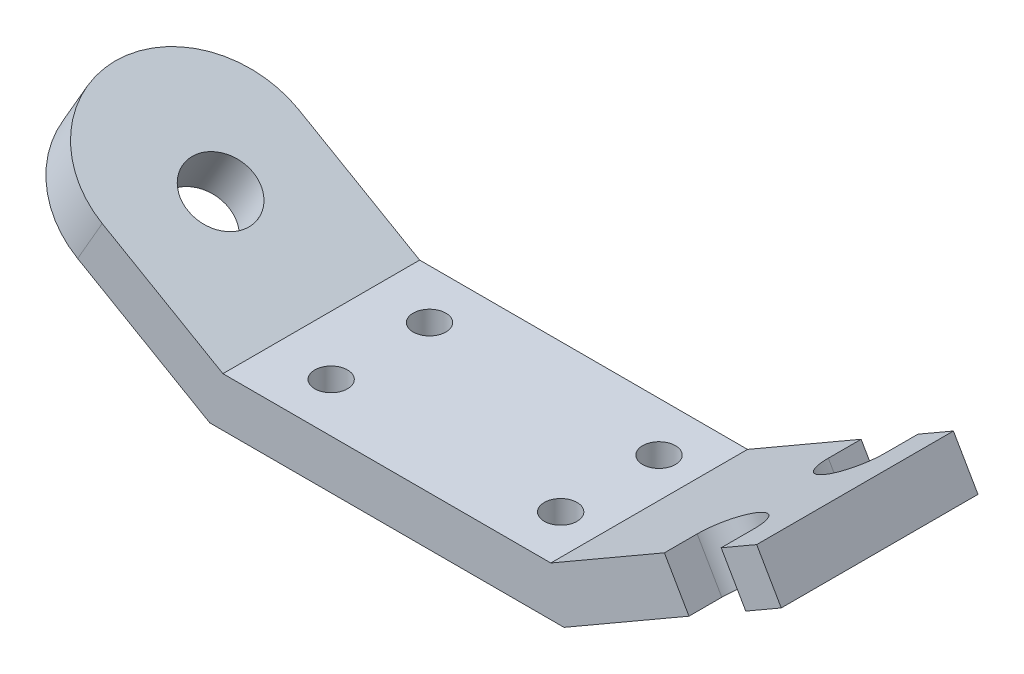
ISO-10303-21;
HEADER;
FILE_DESCRIPTION(('STEP AP214'),'2;1');
FILE_NAME('part.step','',(''),(''),'','','');
FILE_SCHEMA(('AUTOMOTIVE_DESIGN { 1 0 10303 214 1 1 1 1 }'));
ENDSEC;
DATA;
#1=APPLICATION_CONTEXT('core data for automotive mechanical design processes');
#2=APPLICATION_PROTOCOL_DEFINITION('international standard','automotive_design',2000,#1);
#3=PRODUCT_CONTEXT('',#1,'mechanical');
#4=PRODUCT('Part','Part','',(#3));
#5=PRODUCT_RELATED_PRODUCT_CATEGORY('part','',(#4));
#6=PRODUCT_DEFINITION_FORMATION('','',#4);
#7=PRODUCT_DEFINITION_CONTEXT('part definition',#1,'design');
#8=PRODUCT_DEFINITION('design','',#6,#7);
#9=PRODUCT_DEFINITION_SHAPE('','',#8);
#10=(LENGTH_UNIT() NAMED_UNIT(*) SI_UNIT(.MILLI.,.METRE.));
#11=(NAMED_UNIT(*) PLANE_ANGLE_UNIT() SI_UNIT($,.RADIAN.));
#12=(NAMED_UNIT(*) SI_UNIT($,.STERADIAN.) SOLID_ANGLE_UNIT());
#13=UNCERTAINTY_MEASURE_WITH_UNIT(LENGTH_MEASURE(1.E-05),#10,'distance_accuracy_value','');
#14=(GEOMETRIC_REPRESENTATION_CONTEXT(3) GLOBAL_UNCERTAINTY_ASSIGNED_CONTEXT((#13)) GLOBAL_UNIT_ASSIGNED_CONTEXT((#10,
#11,#12)) REPRESENTATION_CONTEXT('',''));
#15=CARTESIAN_POINT('',(0.,0.,0.));
#16=DIRECTION('',(0.,0.,1.));
#17=DIRECTION('',(1.,0.,0.));
#18=AXIS2_PLACEMENT_3D('',#15,#16,#17);
#19=CARTESIAN_POINT('',(136.229473419497,18.6076951545868,-24.));
#20=DIRECTION('',(0.,0.,-1.));
#21=DIRECTION('',(-1.,0.,0.));
#22=AXIS2_PLACEMENT_3D('',#19,#20,#21);
#23=PLANE('',#22);
#24=DIRECTION('',(0.500000000000001,-0.866025403784438,0.));
#25=VECTOR('',#24,1.);
#26=CARTESIAN_POINT('',(127.569219381653,13.6076951545868,-24.));
#27=LINE('',#26,#25);
#28=CARTESIAN_POINT('',(121.569219381653,24.,-24.));
#29=VERTEX_POINT('',#28);
#30=CARTESIAN_POINT('',(127.569219381653,13.6076951545868,-24.));
#31=VERTEX_POINT('',#30);
#32=EDGE_CURVE('E11',#29,#31,#27,.T.);
#33=ORIENTED_EDGE('',*,*,#32,.F.);
#34=DIRECTION('',(0.866025403784438,0.500000000000001,0.));
#35=VECTOR('',#34,1.);
#36=CARTESIAN_POINT('',(80.,0.,-24.));
#37=LINE('',#36,#35);
#38=CARTESIAN_POINT('',(130.229473419497,29.0000000000001,-24.));
#39=VERTEX_POINT('',#38);
#40=EDGE_CURVE('E159',#29,#39,#37,.T.);
#41=ORIENTED_EDGE('',*,*,#40,.T.);
#42=DIRECTION('',(0.500000000000001,-0.866025403784438,0.));
#43=VECTOR('',#42,1.);
#44=CARTESIAN_POINT('',(130.229473419497,29.0000000000001,-24.));
#45=LINE('',#44,#43);
#46=CARTESIAN_POINT('',(136.229473419497,18.6076951545868,-24.));
#47=VERTEX_POINT('',#46);
#48=EDGE_CURVE('E167',#39,#47,#45,.T.);
#49=ORIENTED_EDGE('',*,*,#48,.T.);
#50=DIRECTION('',(0.866025403784438,0.500000000000001,0.));
#51=VECTOR('',#50,1.);
#52=CARTESIAN_POINT('',(86.,-10.3923048454133,-24.));
#53=LINE('',#52,#51);
#54=EDGE_CURVE('E161',#31,#47,#53,.T.);
#55=ORIENTED_EDGE('',*,*,#54,.F.);
#56=EDGE_LOOP('',(#33,#41,#49,#55));
#57=FACE_BOUND('',#56,.T.);
#58=ADVANCED_FACE('F31',(#57),#23,.T.);
#59=CARTESIAN_POINT('',(136.229473419497,18.6076951545868,24.));
#60=DIRECTION('',(0.,0.,-1.));
#61=DIRECTION('',(-1.,0.,0.));
#62=AXIS2_PLACEMENT_3D('',#59,#60,#61);
#63=PLANE('',#62);
#64=DIRECTION('',(0.866025403784438,0.500000000000001,0.));
#65=VECTOR('',#64,1.);
#66=CARTESIAN_POINT('',(86.,-10.3923048454133,24.));
#67=LINE('',#66,#65);
#68=CARTESIAN_POINT('',(83.2153903091735,-12.,24.));
#69=VERTEX_POINT('',#68);
#70=CARTESIAN_POINT('',(113.712812921102,5.60769515458678,24.));
#71=VERTEX_POINT('',#70);
#72=EDGE_CURVE('E267',#69,#71,#67,.T.);
#73=ORIENTED_EDGE('',*,*,#72,.T.);
#74=DIRECTION('',(-0.500000000000001,0.866025403784438,0.));
#75=VECTOR('',#74,1.);
#76=CARTESIAN_POINT('',(113.712812921102,5.60769515458677,24.));
#77=LINE('',#76,#75);
#78=CARTESIAN_POINT('',(107.712812921102,16.,24.));
#79=VERTEX_POINT('',#78);
#80=EDGE_CURVE('E216',#71,#79,#77,.T.);
#81=ORIENTED_EDGE('',*,*,#80,.T.);
#82=DIRECTION('',(0.866025403784438,0.500000000000001,0.));
#83=VECTOR('',#82,1.);
#84=CARTESIAN_POINT('',(80.,0.,24.));
#85=LINE('',#84,#83);
#86=CARTESIAN_POINT('',(80.,0.,24.));
#87=VERTEX_POINT('',#86);
#88=EDGE_CURVE('E239',#87,#79,#85,.T.);
#89=ORIENTED_EDGE('',*,*,#88,.F.);
#90=DIRECTION('',(1.,0.,0.));
#91=VECTOR('',#90,1.);
#92=CARTESIAN_POINT('',(0.,0.,24.));
#93=LINE('',#92,#91);
#94=CARTESIAN_POINT('',(0.,0.,24.));
#95=VERTEX_POINT('',#94);
#96=EDGE_CURVE('E235',#95,#87,#93,.T.);
#97=ORIENTED_EDGE('',*,*,#96,.F.);
#98=DIRECTION('',(0.866025403784442,-0.499999999999995,0.));
#99=VECTOR('',#98,1.);
#100=CARTESIAN_POINT('',(0.,0.,24.));
#101=LINE('',#100,#99);
#102=CARTESIAN_POINT('',(-29.444863728671,16.9999999999998,24.));
#103=VERTEX_POINT('',#102);
#104=EDGE_CURVE('E246',#103,#95,#101,.T.);
#105=ORIENTED_EDGE('',*,*,#104,.F.);
#106=DIRECTION('',(-0.499999999999997,-0.866025403784441,0.));
#107=VECTOR('',#106,1.);
#108=CARTESIAN_POINT('',(-29.444863728671,16.9999999999998,24.));
#109=LINE('',#108,#107);
#110=CARTESIAN_POINT('',(-35.444863728671,6.60769515458654,24.));
#111=VERTEX_POINT('',#110);
#112=EDGE_CURVE('E200',#103,#111,#109,.T.);
#113=ORIENTED_EDGE('',*,*,#112,.T.);
#114=DIRECTION('',(0.866025403784442,-0.499999999999995,0.));
#115=VECTOR('',#114,1.);
#116=CARTESIAN_POINT('',(-5.99999999999994,-10.3923048454133,24.));
#117=LINE('',#116,#115);
#118=CARTESIAN_POINT('',(-3.21539030917343,-12.,24.));
#119=VERTEX_POINT('',#118);
#120=EDGE_CURVE('E253',#111,#119,#117,.T.);
#121=ORIENTED_EDGE('',*,*,#120,.T.);
#122=DIRECTION('',(1.,0.,0.));
#123=VECTOR('',#122,1.);
#124=CARTESIAN_POINT('',(0.,-12.,24.));
#125=LINE('',#124,#123);
#126=EDGE_CURVE('E188',#119,#69,#125,.T.);
#127=ORIENTED_EDGE('',*,*,#126,.T.);
#128=EDGE_LOOP('',(#73,#81,#89,#97,#105,#113,#121,#127));
#129=FACE_BOUND('',#128,.T.);
#130=ADVANCED_FACE('F242',(#129),#63,.F.);
#131=CARTESIAN_POINT('',(-29.444863728671,16.9999999999998,0.));
#132=DIRECTION('',(0.499999999999997,0.866025403784441,0.));
#133=DIRECTION('',(-0.866025403784441,0.499999999999997,0.));
#134=AXIS2_PLACEMENT_3D('',#131,#132,#133);
#135=CYLINDRICAL_SURFACE('',#134,24.);
#136=ORIENTED_EDGE('',*,*,#112,.F.);
#137=CARTESIAN_POINT('',(-29.444863728671,16.9999999999998,0.));
#138=DIRECTION('',(0.499999999999995,0.866025403784442,0.));
#139=DIRECTION('',(-0.866025403784442,0.499999999999995,0.));
#140=AXIS2_PLACEMENT_3D('',#137,#138,#139);
#141=CIRCLE('',#140,24.);
#142=CARTESIAN_POINT('',(-29.444863728671,16.9999999999998,-24.));
#143=VERTEX_POINT('',#142);
#144=EDGE_CURVE('E206',#143,#103,#141,.T.);
#145=ORIENTED_EDGE('',*,*,#144,.F.);
#146=DIRECTION('',(0.499999999999997,0.866025403784441,0.));
#147=VECTOR('',#146,1.);
#148=CARTESIAN_POINT('',(12.6698729810772,89.9448637286706,-24.));
#149=LINE('',#148,#147);
#150=CARTESIAN_POINT('',(-35.444863728671,6.60769515458654,-24.));
#151=VERTEX_POINT('',#150);
#152=EDGE_CURVE('E203',#151,#143,#149,.T.);
#153=ORIENTED_EDGE('',*,*,#152,.F.);
#154=CARTESIAN_POINT('',(-35.444863728671,6.60769515458654,0.));
#155=DIRECTION('',(0.499999999999995,0.866025403784442,0.));
#156=DIRECTION('',(-0.866025403784442,0.499999999999995,0.));
#157=AXIS2_PLACEMENT_3D('',#154,#155,#156);
#158=CIRCLE('',#157,24.);
#159=EDGE_CURVE('E208',#111,#151,#158,.F.);
#160=ORIENTED_EDGE('',*,*,#159,.F.);
#161=EDGE_LOOP('',(#136,#145,#153,#160));
#162=FACE_BOUND('',#161,.T.);
#163=ADVANCED_FACE('F33',(#162),#135,.T.);
#164=CARTESIAN_POINT('',(86.,-10.3923048454133,24.));
#165=DIRECTION('',(-0.500000000000001,0.866025403784438,0.));
#166=DIRECTION('',(-0.866025403784438,-0.500000000000001,0.));
#167=AXIS2_PLACEMENT_3D('',#164,#165,#166);
#168=PLANE('',#167);
#169=CARTESIAN_POINT('',(120.641016151378,9.60769515458679,-16.));
#170=DIRECTION('',(-0.500000000000001,0.866025403784438,0.));
#171=DIRECTION('',(-0.866025403784438,-0.500000000000001,0.));
#172=AXIS2_PLACEMENT_3D('',#169,#170,#171);
#173=CIRCLE('',#172,8.);
#174=CARTESIAN_POINT('',(113.712812921102,5.60769515458678,-16.));
#175=VERTEX_POINT('',#174);
#176=CARTESIAN_POINT('',(127.569219381653,13.6076951545868,-16.));
#177=VERTEX_POINT('',#176);
#178=EDGE_CURVE('E315',#175,#177,#173,.T.);
#179=ORIENTED_EDGE('',*,*,#178,.T.);
#180=DIRECTION('',(0.,0.,-1.));
#181=VECTOR('',#180,1.);
#182=CARTESIAN_POINT('',(127.569219381653,13.6076951545868,24.));
#183=LINE('',#182,#181);
#184=EDGE_CURVE('E261',#177,#31,#183,.T.);
#185=ORIENTED_EDGE('',*,*,#184,.T.);
#186=ORIENTED_EDGE('',*,*,#54,.T.);
#187=DIRECTION('',(0.,0.,-1.));
#188=VECTOR('',#187,1.);
#189=CARTESIAN_POINT('',(136.229473419497,18.6076951545868,24.));
#190=LINE('',#189,#188);
#191=CARTESIAN_POINT('',(136.229473419497,18.6076951545868,24.));
#192=VERTEX_POINT('',#191);
#193=EDGE_CURVE('E197',#192,#47,#190,.T.);
#194=ORIENTED_EDGE('',*,*,#193,.F.);
#195=CARTESIAN_POINT('',(127.569219381653,13.6076951545868,24.));
#196=VERTEX_POINT('',#195);
#197=EDGE_CURVE('E183',#196,#192,#67,.T.);
#198=ORIENTED_EDGE('',*,*,#197,.F.);
#199=DIRECTION('',(0.,0.,-1.));
#200=VECTOR('',#199,1.);
#201=CARTESIAN_POINT('',(127.569219381653,13.6076951545868,24.));
#202=LINE('',#201,#200);
#203=CARTESIAN_POINT('',(127.569219381653,13.6076951545868,16.));
#204=VERTEX_POINT('',#203);
#205=EDGE_CURVE('E54',#196,#204,#202,.T.);
#206=ORIENTED_EDGE('',*,*,#205,.T.);
#207=CARTESIAN_POINT('',(120.641016151378,9.60769515458679,16.));
#208=DIRECTION('',(-0.500000000000001,0.866025403784438,0.));
#209=DIRECTION('',(-0.866025403784438,-0.500000000000001,0.));
#210=AXIS2_PLACEMENT_3D('',#207,#208,#209);
#211=CIRCLE('',#210,8.);
#212=CARTESIAN_POINT('',(113.712812921102,5.60769515458678,16.));
#213=VERTEX_POINT('',#212);
#214=EDGE_CURVE('E294',#204,#213,#211,.T.);
#215=ORIENTED_EDGE('',*,*,#214,.T.);
#216=DIRECTION('',(0.,0.,1.));
#217=VECTOR('',#216,1.);
#218=CARTESIAN_POINT('',(113.712812921102,5.60769515458677,24.));
#219=LINE('',#218,#217);
#220=EDGE_CURVE('E299',#213,#71,#219,.T.);
#221=ORIENTED_EDGE('',*,*,#220,.T.);
#222=ORIENTED_EDGE('',*,*,#72,.F.);
#223=DIRECTION('',(0.,0.,-1.));
#224=VECTOR('',#223,1.);
#225=CARTESIAN_POINT('',(83.2153903091735,-12.,24.));
#226=LINE('',#225,#224);
#227=CARTESIAN_POINT('',(83.2153903091735,-12.,-24.));
#228=VERTEX_POINT('',#227);
#229=EDGE_CURVE('E184',#69,#228,#226,.T.);
#230=ORIENTED_EDGE('',*,*,#229,.T.);
#231=CARTESIAN_POINT('',(113.712812921102,5.60769515458677,-24.));
#232=VERTEX_POINT('',#231);
#233=EDGE_CURVE('E171',#228,#232,#53,.T.);
#234=ORIENTED_EDGE('',*,*,#233,.T.);
#235=DIRECTION('',(0.,0.,1.));
#236=VECTOR('',#235,1.);
#237=CARTESIAN_POINT('',(113.712812921102,5.60769515458677,24.));
#238=LINE('',#237,#236);
#239=EDGE_CURVE('E46',#232,#175,#238,.T.);
#240=ORIENTED_EDGE('',*,*,#239,.T.);
#241=EDGE_LOOP('',(#179,#185,#186,#194,#198,#206,#215,#221,#222,#230,#234,#240));
#242=FACE_BOUND('',#241,.T.);
#243=ADVANCED_FACE('F258',(#242),#168,.F.);
#244=CARTESIAN_POINT('',(130.229473419497,29.0000000000001,24.));
#245=DIRECTION('',(0.866025403784438,0.500000000000001,0.));
#246=DIRECTION('',(-0.500000000000001,0.866025403784438,0.));
#247=AXIS2_PLACEMENT_3D('',#244,#245,#246);
#248=PLANE('',#247);
#249=ORIENTED_EDGE('',*,*,#48,.F.);
#250=DIRECTION('',(0.,0.,-1.));
#251=VECTOR('',#250,1.);
#252=CARTESIAN_POINT('',(130.229473419497,29.0000000000001,24.));
#253=LINE('',#252,#251);
#254=CARTESIAN_POINT('',(130.229473419497,29.0000000000001,24.));
#255=VERTEX_POINT('',#254);
#256=EDGE_CURVE('E164',#255,#39,#253,.T.);
#257=ORIENTED_EDGE('',*,*,#256,.F.);
#258=DIRECTION('',(0.500000000000001,-0.866025403784438,0.));
#259=VECTOR('',#258,1.);
#260=CARTESIAN_POINT('',(130.229473419497,29.0000000000001,24.));
#261=LINE('',#260,#259);
#262=EDGE_CURVE('E248',#255,#192,#261,.T.);
#263=ORIENTED_EDGE('',*,*,#262,.T.);
#264=ORIENTED_EDGE('',*,*,#193,.T.);
#265=EDGE_LOOP('',(#249,#257,#263,#264));
#266=FACE_BOUND('',#265,.T.);
#267=ADVANCED_FACE('F263',(#266),#248,.T.);
#268=CARTESIAN_POINT('',(80.,0.,24.));
#269=DIRECTION('',(-0.500000000000001,0.866025403784438,0.));
#270=DIRECTION('',(-0.866025403784438,-0.500000000000001,0.));
#271=AXIS2_PLACEMENT_3D('',#268,#269,#270);
#272=PLANE('',#271);
#273=DIRECTION('',(0.,0.,-1.));
#274=VECTOR('',#273,1.);
#275=CARTESIAN_POINT('',(121.569219381653,24.,-16.));
#276=LINE('',#275,#274);
#277=CARTESIAN_POINT('',(121.569219381653,24.,-16.));
#278=VERTEX_POINT('',#277);
#279=EDGE_CURVE('E144',#278,#29,#276,.T.);
#280=ORIENTED_EDGE('',*,*,#279,.F.);
#281=CARTESIAN_POINT('',(114.641016151378,20.,-16.));
#282=DIRECTION('',(-0.500000000000001,0.866025403784438,0.));
#283=DIRECTION('',(-0.866025403784438,-0.500000000000001,0.));
#284=AXIS2_PLACEMENT_3D('',#281,#282,#283);
#285=CIRCLE('',#284,8.);
#286=CARTESIAN_POINT('',(107.712812921102,16.,-16.));
#287=VERTEX_POINT('',#286);
#288=EDGE_CURVE('E225',#287,#278,#285,.T.);
#289=ORIENTED_EDGE('',*,*,#288,.F.);
#290=DIRECTION('',(0.,0.,1.));
#291=VECTOR('',#290,1.);
#292=CARTESIAN_POINT('',(107.712812921102,16.,-24.));
#293=LINE('',#292,#291);
#294=CARTESIAN_POINT('',(107.712812921102,16.,-24.));
#295=VERTEX_POINT('',#294);
#296=EDGE_CURVE('E154',#295,#287,#293,.T.);
#297=ORIENTED_EDGE('',*,*,#296,.F.);
#298=CARTESIAN_POINT('',(80.,0.,-24.));
#299=VERTEX_POINT('',#298);
#300=EDGE_CURVE('E166',#299,#295,#37,.T.);
#301=ORIENTED_EDGE('',*,*,#300,.F.);
#302=DIRECTION('',(0.,0.,-1.));
#303=VECTOR('',#302,1.);
#304=CARTESIAN_POINT('',(80.,0.,24.));
#305=LINE('',#304,#303);
#306=EDGE_CURVE('E194',#87,#299,#305,.T.);
#307=ORIENTED_EDGE('',*,*,#306,.F.);
#308=ORIENTED_EDGE('',*,*,#88,.T.);
#309=DIRECTION('',(0.,0.,1.));
#310=VECTOR('',#309,1.);
#311=CARTESIAN_POINT('',(107.712812921102,16.,24.));
#312=LINE('',#311,#310);
#313=CARTESIAN_POINT('',(107.712812921102,16.,16.));
#314=VERTEX_POINT('',#313);
#315=EDGE_CURVE('E306',#314,#79,#312,.T.);
#316=ORIENTED_EDGE('',*,*,#315,.F.);
#317=CARTESIAN_POINT('',(114.641016151378,20.,16.));
#318=DIRECTION('',(-0.500000000000001,0.866025403784438,0.));
#319=DIRECTION('',(0.866025403784438,0.500000000000001,0.));
#320=AXIS2_PLACEMENT_3D('',#317,#318,#319);
#321=CIRCLE('',#320,8.);
#322=CARTESIAN_POINT('',(121.569219381653,24.,16.));
#323=VERTEX_POINT('',#322);
#324=EDGE_CURVE('E309',#323,#314,#321,.T.);
#325=ORIENTED_EDGE('',*,*,#324,.F.);
#326=DIRECTION('',(0.,0.,-1.));
#327=VECTOR('',#326,1.);
#328=CARTESIAN_POINT('',(121.569219381653,24.,16.));
#329=LINE('',#328,#327);
#330=CARTESIAN_POINT('',(121.569219381653,24.,24.));
#331=VERTEX_POINT('',#330);
#332=EDGE_CURVE('E312',#331,#323,#329,.T.);
#333=ORIENTED_EDGE('',*,*,#332,.F.);
#334=EDGE_CURVE('E244',#331,#255,#85,.T.);
#335=ORIENTED_EDGE('',*,*,#334,.T.);
#336=ORIENTED_EDGE('',*,*,#256,.T.);
#337=ORIENTED_EDGE('',*,*,#40,.F.);
#338=EDGE_LOOP('',(#280,#289,#297,#301,#307,#308,#316,#325,#333,#335,#336,#337));
#339=FACE_BOUND('',#338,.T.);
#340=ADVANCED_FACE('F162',(#339),#272,.T.);
#341=CARTESIAN_POINT('',(0.,0.,24.));
#342=DIRECTION('',(0.,1.,0.));
#343=DIRECTION('',(0.,0.,1.));
#344=AXIS2_PLACEMENT_3D('',#341,#342,#343);
#345=PLANE('',#344);
#346=CARTESIAN_POINT('',(14.4065542470965,0.,-12.));
#347=DIRECTION('',(0.,1.,0.));
#348=DIRECTION('',(0.,0.,-1.));
#349=AXIS2_PLACEMENT_3D('',#346,#347,#348);
#350=CIRCLE('',#349,4.);
#351=CARTESIAN_POINT('',(14.4065542470965,0.,-16.));
#352=VERTEX_POINT('',#351);
#353=EDGE_CURVE('E291',#352,#352,#350,.T.);
#354=ORIENTED_EDGE('',*,*,#353,.F.);
#355=EDGE_LOOP('',(#354));
#356=FACE_BOUND('',#355,.T.);
#357=CARTESIAN_POINT('',(70.4065542470965,0.,-12.));
#358=DIRECTION('',(0.,1.,0.));
#359=DIRECTION('',(0.,0.,-1.));
#360=AXIS2_PLACEMENT_3D('',#357,#358,#359);
#361=CIRCLE('',#360,4.00000000000001);
#362=CARTESIAN_POINT('',(70.4065542470965,0.,-16.));
#363=VERTEX_POINT('',#362);
#364=EDGE_CURVE('E285',#363,#363,#361,.T.);
#365=ORIENTED_EDGE('',*,*,#364,.F.);
#366=EDGE_LOOP('',(#365));
#367=FACE_BOUND('',#366,.T.);
#368=CARTESIAN_POINT('',(70.4065542470965,0.,12.));
#369=DIRECTION('',(0.,1.,0.));
#370=DIRECTION('',(0.,0.,1.));
#371=AXIS2_PLACEMENT_3D('',#368,#369,#370);
#372=CIRCLE('',#371,4.00000000000001);
#373=CARTESIAN_POINT('',(70.4065542470965,0.,16.));
#374=VERTEX_POINT('',#373);
#375=EDGE_CURVE('E279',#374,#374,#372,.T.);
#376=ORIENTED_EDGE('',*,*,#375,.F.);
#377=EDGE_LOOP('',(#376));
#378=FACE_BOUND('',#377,.T.);
#379=CARTESIAN_POINT('',(14.4065542470965,0.,12.));
#380=DIRECTION('',(0.,1.,0.));
#381=DIRECTION('',(0.,0.,1.));
#382=AXIS2_PLACEMENT_3D('',#379,#380,#381);
#383=CIRCLE('',#382,4.);
#384=CARTESIAN_POINT('',(14.4065542470965,0.,16.));
#385=VERTEX_POINT('',#384);
#386=EDGE_CURVE('E273',#385,#385,#383,.T.);
#387=ORIENTED_EDGE('',*,*,#386,.F.);
#388=EDGE_LOOP('',(#387));
#389=FACE_BOUND('',#388,.T.);
#390=DIRECTION('',(1.,0.,0.));
#391=VECTOR('',#390,1.);
#392=CARTESIAN_POINT('',(0.,0.,-24.));
#393=LINE('',#392,#391);
#394=CARTESIAN_POINT('',(0.,0.,-24.));
#395=VERTEX_POINT('',#394);
#396=EDGE_CURVE('E170',#395,#299,#393,.T.);
#397=ORIENTED_EDGE('',*,*,#396,.F.);
#398=DIRECTION('',(0.,0.,-1.));
#399=VECTOR('',#398,1.);
#400=CARTESIAN_POINT('',(0.,0.,24.));
#401=LINE('',#400,#399);
#402=EDGE_CURVE('E191',#95,#395,#401,.T.);
#403=ORIENTED_EDGE('',*,*,#402,.F.);
#404=ORIENTED_EDGE('',*,*,#96,.T.);
#405=ORIENTED_EDGE('',*,*,#306,.T.);
#406=EDGE_LOOP('',(#397,#403,#404,#405));
#407=FACE_BOUND('',#406,.T.);
#408=ADVANCED_FACE('F232',(#356,#367,#378,#389,#407),#345,.T.);
#409=CARTESIAN_POINT('',(0.,0.,24.));
#410=DIRECTION('',(0.499999999999995,0.866025403784442,0.));
#411=DIRECTION('',(-0.866025403784442,0.499999999999995,0.));
#412=AXIS2_PLACEMENT_3D('',#409,#410,#411);
#413=PLANE('',#412);
#414=CARTESIAN_POINT('',(-24.5668346611882,14.1836686047739,0.));
#415=DIRECTION('',(0.499999999999995,0.866025403784442,0.));
#416=DIRECTION('',(-0.866025403784442,0.499999999999995,0.));
#417=AXIS2_PLACEMENT_3D('',#414,#415,#416);
#418=CIRCLE('',#417,8.);
#419=CARTESIAN_POINT('',(-31.4950378914638,18.1836686047738,0.));
#420=VERTEX_POINT('',#419);
#421=EDGE_CURVE('E214',#420,#420,#418,.T.);
#422=ORIENTED_EDGE('',*,*,#421,.F.);
#423=EDGE_LOOP('',(#422));
#424=FACE_BOUND('',#423,.T.);
#425=DIRECTION('',(0.866025403784442,-0.499999999999995,0.));
#426=VECTOR('',#425,1.);
#427=CARTESIAN_POINT('',(0.,0.,-24.));
#428=LINE('',#427,#426);
#429=EDGE_CURVE('E177',#143,#395,#428,.T.);
#430=ORIENTED_EDGE('',*,*,#429,.F.);
#431=ORIENTED_EDGE('',*,*,#144,.T.);
#432=ORIENTED_EDGE('',*,*,#104,.T.);
#433=ORIENTED_EDGE('',*,*,#402,.T.);
#434=EDGE_LOOP('',(#430,#431,#432,#433));
#435=FACE_BOUND('',#434,.T.);
#436=ADVANCED_FACE('F488',(#424,#435),#413,.T.);
#437=CARTESIAN_POINT('',(-5.99999999999994,-10.3923048454133,24.));
#438=DIRECTION('',(0.499999999999995,0.866025403784442,0.));
#439=DIRECTION('',(-0.866025403784442,0.499999999999995,0.));
#440=AXIS2_PLACEMENT_3D('',#437,#438,#439);
#441=PLANE('',#440);
#442=CARTESIAN_POINT('',(-30.5668346611882,3.79136375936057,0.));
#443=DIRECTION('',(0.499999999999995,0.866025403784442,0.));
#444=DIRECTION('',(-0.866025403784442,0.499999999999995,0.));
#445=AXIS2_PLACEMENT_3D('',#442,#443,#444);
#446=CIRCLE('',#445,8.);
#447=CARTESIAN_POINT('',(-37.4950378914637,7.79136375936053,0.));
#448=VERTEX_POINT('',#447);
#449=EDGE_CURVE('E211',#448,#448,#446,.T.);
#450=ORIENTED_EDGE('',*,*,#449,.T.);
#451=EDGE_LOOP('',(#450));
#452=FACE_BOUND('',#451,.T.);
#453=ORIENTED_EDGE('',*,*,#120,.F.);
#454=ORIENTED_EDGE('',*,*,#159,.T.);
#455=DIRECTION('',(0.866025403784442,-0.499999999999995,0.));
#456=VECTOR('',#455,1.);
#457=CARTESIAN_POINT('',(-5.99999999999994,-10.3923048454133,-24.));
#458=LINE('',#457,#456);
#459=CARTESIAN_POINT('',(-3.21539030917343,-12.,-24.));
#460=VERTEX_POINT('',#459);
#461=EDGE_CURVE('E179',#151,#460,#458,.T.);
#462=ORIENTED_EDGE('',*,*,#461,.T.);
#463=DIRECTION('',(0.,0.,-1.));
#464=VECTOR('',#463,1.);
#465=CARTESIAN_POINT('',(-3.21539030917343,-12.,24.));
#466=LINE('',#465,#464);
#467=EDGE_CURVE('E187',#119,#460,#466,.T.);
#468=ORIENTED_EDGE('',*,*,#467,.F.);
#469=EDGE_LOOP('',(#453,#454,#462,#468));
#470=FACE_BOUND('',#469,.T.);
#471=ADVANCED_FACE('F356',(#452,#470),#441,.F.);
#472=CARTESIAN_POINT('',(0.,-12.,24.));
#473=DIRECTION('',(0.,1.,0.));
#474=DIRECTION('',(0.,0.,1.));
#475=AXIS2_PLACEMENT_3D('',#472,#473,#474);
#476=PLANE('',#475);
#477=CARTESIAN_POINT('',(14.4065542470965,-12.,-12.));
#478=DIRECTION('',(0.,1.,0.));
#479=DIRECTION('',(0.,0.,-1.));
#480=AXIS2_PLACEMENT_3D('',#477,#478,#479);
#481=CIRCLE('',#480,4.);
#482=CARTESIAN_POINT('',(14.4065542470965,-12.,-16.));
#483=VERTEX_POINT('',#482);
#484=EDGE_CURVE('E288',#483,#483,#481,.T.);
#485=ORIENTED_EDGE('',*,*,#484,.T.);
#486=EDGE_LOOP('',(#485));
#487=FACE_BOUND('',#486,.T.);
#488=CARTESIAN_POINT('',(70.4065542470965,-12.,-12.));
#489=DIRECTION('',(0.,1.,0.));
#490=DIRECTION('',(0.,0.,-1.));
#491=AXIS2_PLACEMENT_3D('',#488,#489,#490);
#492=CIRCLE('',#491,4.00000000000001);
#493=CARTESIAN_POINT('',(70.4065542470965,-12.,-16.));
#494=VERTEX_POINT('',#493);
#495=EDGE_CURVE('E282',#494,#494,#492,.T.);
#496=ORIENTED_EDGE('',*,*,#495,.T.);
#497=EDGE_LOOP('',(#496));
#498=FACE_BOUND('',#497,.T.);
#499=CARTESIAN_POINT('',(70.4065542470965,-12.,12.));
#500=DIRECTION('',(0.,1.,0.));
#501=DIRECTION('',(0.,0.,1.));
#502=AXIS2_PLACEMENT_3D('',#499,#500,#501);
#503=CIRCLE('',#502,4.00000000000001);
#504=CARTESIAN_POINT('',(70.4065542470965,-12.,16.));
#505=VERTEX_POINT('',#504);
#506=EDGE_CURVE('E276',#505,#505,#503,.T.);
#507=ORIENTED_EDGE('',*,*,#506,.T.);
#508=EDGE_LOOP('',(#507));
#509=FACE_BOUND('',#508,.T.);
#510=CARTESIAN_POINT('',(14.4065542470965,-12.,12.));
#511=DIRECTION('',(0.,1.,0.));
#512=DIRECTION('',(0.,0.,1.));
#513=AXIS2_PLACEMENT_3D('',#510,#511,#512);
#514=CIRCLE('',#513,4.);
#515=CARTESIAN_POINT('',(14.4065542470965,-12.,16.));
#516=VERTEX_POINT('',#515);
#517=EDGE_CURVE('E272',#516,#516,#514,.T.);
#518=ORIENTED_EDGE('',*,*,#517,.T.);
#519=EDGE_LOOP('',(#518));
#520=FACE_BOUND('',#519,.T.);
#521=DIRECTION('',(1.,0.,0.));
#522=VECTOR('',#521,1.);
#523=CARTESIAN_POINT('',(0.,-12.,-24.));
#524=LINE('',#523,#522);
#525=EDGE_CURVE('E181',#460,#228,#524,.T.);
#526=ORIENTED_EDGE('',*,*,#525,.T.);
#527=ORIENTED_EDGE('',*,*,#229,.F.);
#528=ORIENTED_EDGE('',*,*,#126,.F.);
#529=ORIENTED_EDGE('',*,*,#467,.T.);
#530=EDGE_LOOP('',(#526,#527,#528,#529));
#531=FACE_BOUND('',#530,.T.);
#532=ADVANCED_FACE('F352',(#487,#498,#509,#520,#531),#476,.F.);
#533=ORIENTED_EDGE('',*,*,#334,.F.);
#534=DIRECTION('',(0.500000000000001,-0.866025403784438,0.));
#535=VECTOR('',#534,1.);
#536=CARTESIAN_POINT('',(127.569219381653,13.6076951545868,24.));
#537=LINE('',#536,#535);
#538=EDGE_CURVE('E210',#331,#196,#537,.T.);
#539=ORIENTED_EDGE('',*,*,#538,.T.);
#540=ORIENTED_EDGE('',*,*,#197,.T.);
#541=ORIENTED_EDGE('',*,*,#262,.F.);
#542=EDGE_LOOP('',(#533,#539,#540,#541));
#543=FACE_BOUND('',#542,.T.);
#544=ADVANCED_FACE('F341',(#543),#63,.F.);
#545=DIRECTION('',(-0.500000000000001,0.866025403784438,0.));
#546=VECTOR('',#545,1.);
#547=CARTESIAN_POINT('',(113.712812921102,5.60769515458677,-24.));
#548=LINE('',#547,#546);
#549=EDGE_CURVE('E39',#232,#295,#548,.T.);
#550=ORIENTED_EDGE('',*,*,#549,.F.);
#551=ORIENTED_EDGE('',*,*,#233,.F.);
#552=ORIENTED_EDGE('',*,*,#525,.F.);
#553=ORIENTED_EDGE('',*,*,#461,.F.);
#554=ORIENTED_EDGE('',*,*,#152,.T.);
#555=ORIENTED_EDGE('',*,*,#429,.T.);
#556=ORIENTED_EDGE('',*,*,#396,.T.);
#557=ORIENTED_EDGE('',*,*,#300,.T.);
#558=EDGE_LOOP('',(#550,#551,#552,#553,#554,#555,#556,#557));
#559=FACE_BOUND('',#558,.T.);
#560=ADVANCED_FACE('F227',(#559),#23,.T.);
#561=CARTESIAN_POINT('',(-43.820355438769,-19.1644076065794,0.));
#562=DIRECTION('',(0.499999999999995,0.866025403784441,0.));
#563=DIRECTION('',(-0.866025403784442,0.499999999999995,0.));
#564=AXIS2_PLACEMENT_3D('',#561,#562,#563);
#565=CYLINDRICAL_SURFACE('',#564,8.);
#566=CARTESIAN_POINT('',(-31.4950378914638,18.1836686047738,0.));
#567=CARTESIAN_POINT('',(-31.5575378914638,18.0754154293008,0.));
#568=CARTESIAN_POINT('',(-31.6200378914638,17.9671622538277,0.));
#569=CARTESIAN_POINT('',(-31.7450378914638,17.7506559028816,0.));
#570=CARTESIAN_POINT('',(-31.8075378914638,17.6424027274086,0.));
#571=CARTESIAN_POINT('',(-31.9325378914638,17.4258963764624,0.));
#572=CARTESIAN_POINT('',(-31.9950378914638,17.3176432009894,0.));
#573=CARTESIAN_POINT('',(-32.1200378914638,17.1011368500433,0.));
#574=CARTESIAN_POINT('',(-32.1825378914638,16.9928836745702,0.));
#575=CARTESIAN_POINT('',(-32.3075378914638,16.7763773236241,0.));
#576=CARTESIAN_POINT('',(-32.3700378914638,16.6681241481511,0.));
#577=CARTESIAN_POINT('',(-32.4950378914638,16.4516177972049,0.));
#578=CARTESIAN_POINT('',(-32.5575378914638,16.3433646217319,0.));
#579=CARTESIAN_POINT('',(-32.6825378914638,16.1268582707858,0.));
#580=CARTESIAN_POINT('',(-32.7450378914638,16.0186050953127,0.));
#581=CARTESIAN_POINT('',(-32.8700378914638,15.8020987443666,0.));
#582=CARTESIAN_POINT('',(-32.9325378914638,15.6938455688936,0.));
#583=CARTESIAN_POINT('',(-33.0575378914638,15.4773392179474,0.));
#584=CARTESIAN_POINT('',(-33.1200378914638,15.3690860424744,0.));
#585=CARTESIAN_POINT('',(-33.2450378914638,15.1525796915283,0.));
#586=CARTESIAN_POINT('',(-33.3075378914638,15.0443265160552,0.));
#587=CARTESIAN_POINT('',(-33.4325378914638,14.8278201651091,0.));
#588=CARTESIAN_POINT('',(-33.4950378914638,14.7195669896361,0.));
#589=CARTESIAN_POINT('',(-33.6200378914638,14.50306063869,0.));
#590=CARTESIAN_POINT('',(-33.6825378914638,14.3948074632169,0.));
#591=CARTESIAN_POINT('',(-33.8075378914638,14.1783011122708,0.));
#592=CARTESIAN_POINT('',(-33.8700378914638,14.0700479367977,0.));
#593=CARTESIAN_POINT('',(-33.9950378914638,13.8535415858516,0.));
#594=CARTESIAN_POINT('',(-34.0575378914638,13.7452884103786,0.));
#595=CARTESIAN_POINT('',(-34.1825378914638,13.5287820594325,0.));
#596=CARTESIAN_POINT('',(-34.2450378914638,13.4205288839594,0.));
#597=CARTESIAN_POINT('',(-34.3700378914638,13.2040225330133,0.));
#598=CARTESIAN_POINT('',(-34.4325378914638,13.0957693575402,0.));
#599=CARTESIAN_POINT('',(-34.5575378914638,12.8792630065941,0.));
#600=CARTESIAN_POINT('',(-34.6200378914638,12.7710098311211,0.));
#601=CARTESIAN_POINT('',(-34.7450378914638,12.554503480175,0.));
#602=CARTESIAN_POINT('',(-34.8075378914638,12.4462503047019,0.));
#603=CARTESIAN_POINT('',(-34.9325378914638,12.2297439537558,0.));
#604=CARTESIAN_POINT('',(-34.9950378914638,12.1214907782827,0.));
#605=CARTESIAN_POINT('',(-35.1200378914638,11.9049844273366,0.));
#606=CARTESIAN_POINT('',(-35.1825378914638,11.7967312518636,0.));
#607=CARTESIAN_POINT('',(-35.3075378914638,11.5802249009175,0.));
#608=CARTESIAN_POINT('',(-35.3700378914637,11.4719717254444,0.));
#609=CARTESIAN_POINT('',(-35.4950378914637,11.2554653744983,0.));
#610=CARTESIAN_POINT('',(-35.5575378914637,11.1472121990252,0.));
#611=CARTESIAN_POINT('',(-35.6825378914637,10.9307058480791,0.));
#612=CARTESIAN_POINT('',(-35.7450378914637,10.8224526726061,0.));
#613=CARTESIAN_POINT('',(-35.8700378914637,10.60594632166,0.));
#614=CARTESIAN_POINT('',(-35.9325378914637,10.4976931461869,0.));
#615=CARTESIAN_POINT('',(-36.0575378914637,10.2811867952408,0.));
#616=CARTESIAN_POINT('',(-36.1200378914637,10.1729336197677,0.));
#617=CARTESIAN_POINT('',(-36.2450378914637,9.95642726882164,0.));
#618=CARTESIAN_POINT('',(-36.3075378914637,9.84817409334858,0.));
#619=CARTESIAN_POINT('',(-36.4325378914637,9.63166774240247,0.));
#620=CARTESIAN_POINT('',(-36.4950378914637,9.52341456692942,0.));
#621=CARTESIAN_POINT('',(-36.6200378914637,9.30690821598331,0.));
#622=CARTESIAN_POINT('',(-36.6825378914637,9.19865504051025,0.));
#623=CARTESIAN_POINT('',(-36.8075378914637,8.98214868956414,0.));
#624=CARTESIAN_POINT('',(-36.8700378914637,8.87389551409108,0.));
#625=CARTESIAN_POINT('',(-36.9950378914637,8.65738916314497,0.));
#626=CARTESIAN_POINT('',(-37.0575378914637,8.54913598767192,0.));
#627=CARTESIAN_POINT('',(-37.1825378914637,8.33262963672581,0.));
#628=CARTESIAN_POINT('',(-37.2450378914637,8.22437646125275,0.));
#629=CARTESIAN_POINT('',(-37.3700378914637,8.00787011030664,0.));
#630=CARTESIAN_POINT('',(-37.4325378914637,7.89961693483358,0.));
#631=CARTESIAN_POINT('',(-37.4950378914637,7.79136375936053,0.));
#632=B_SPLINE_CURVE_WITH_KNOTS('',3,(#566,#567,#568,#569,#570,#571,#572,#573,#574,#575,#576,
#577,#578,#579,#580,#581,#582,#583,#584,#585,#586,#587,#588,#589,#590,#591,#592,#593,#594,#595,
#596,#597,#598,#599,#600,#601,#602,#603,#604,#605,#606,#607,#608,#609,#610,#611,#612,#613,#614,
#615,#616,#617,#618,#619,#620,#621,#622,#623,#624,#625,#626,#627,#628,#629,#630,#631),
.UNSPECIFIED.,.F.,.F.,(4,2,2,2,2,2,2,2,2,2,2,2,2,2,2,2,2,2,2,2,2,2,2,2,2,2,2,2,2,2,2,2,4),(0.,
0.375000000000005,0.750000000000003,1.125,1.50000000000001,1.875,2.25,2.625,3.,3.375,3.75,4.125,
4.50000000000001,4.875,5.25,5.625,6.,6.375,6.75,7.125,7.5,7.87499999999999,8.25,8.625,9.,9.375,
9.75,10.125,10.5,10.875,11.25,11.625,12.),.UNSPECIFIED.);
#633=EDGE_CURVE('BSEAM344',#420,#448,#632,.T.);
#634=ORIENTED_EDGE('',*,*,#421,.T.);
#635=ORIENTED_EDGE('',*,*,#449,.F.);
#636=ORIENTED_EDGE('',*,*,#633,.T.);
#637=ORIENTED_EDGE('',*,*,#633,.F.);
#638=EDGE_LOOP('',(#634,#636,#635,#637));
#639=FACE_BOUND('',#638,.T.);
#640=ADVANCED_FACE('F344',(#639),#565,.F.);
#641=CARTESIAN_POINT('',(14.4065542470965,-12.,12.));
#642=DIRECTION('',(0.,1.,0.));
#643=DIRECTION('',(0.,0.,1.));
#644=AXIS2_PLACEMENT_3D('',#641,#642,#643);
#645=CYLINDRICAL_SURFACE('',#644,4.);
#646=ORIENTED_EDGE('',*,*,#517,.F.);
#647=EDGE_LOOP('',(#646));
#648=FACE_BOUND('',#647,.T.);
#649=ORIENTED_EDGE('',*,*,#386,.T.);
#650=EDGE_LOOP('',(#649));
#651=FACE_BOUND('',#650,.T.);
#652=ADVANCED_FACE('F349',(#648,#651),#645,.F.);
#653=CARTESIAN_POINT('',(70.4065542470965,-12.,12.));
#654=DIRECTION('',(0.,1.,0.));
#655=DIRECTION('',(0.,0.,1.));
#656=AXIS2_PLACEMENT_3D('',#653,#654,#655);
#657=CYLINDRICAL_SURFACE('',#656,4.00000000000001);
#658=ORIENTED_EDGE('',*,*,#506,.F.);
#659=EDGE_LOOP('',(#658));
#660=FACE_BOUND('',#659,.T.);
#661=ORIENTED_EDGE('',*,*,#375,.T.);
#662=EDGE_LOOP('',(#661));
#663=FACE_BOUND('',#662,.T.);
#664=ADVANCED_FACE('F361',(#660,#663),#657,.F.);
#665=CARTESIAN_POINT('',(70.4065542470965,-12.,-12.));
#666=DIRECTION('',(0.,1.,0.));
#667=DIRECTION('',(0.,0.,1.));
#668=AXIS2_PLACEMENT_3D('',#665,#666,#667);
#669=CYLINDRICAL_SURFACE('',#668,4.00000000000001);
#670=ORIENTED_EDGE('',*,*,#495,.F.);
#671=EDGE_LOOP('',(#670));
#672=FACE_BOUND('',#671,.T.);
#673=ORIENTED_EDGE('',*,*,#364,.T.);
#674=EDGE_LOOP('',(#673));
#675=FACE_BOUND('',#674,.T.);
#676=ADVANCED_FACE('F365',(#672,#675),#669,.F.);
#677=CARTESIAN_POINT('',(14.4065542470965,-12.,-12.));
#678=DIRECTION('',(0.,1.,0.));
#679=DIRECTION('',(0.,0.,1.));
#680=AXIS2_PLACEMENT_3D('',#677,#678,#679);
#681=CYLINDRICAL_SURFACE('',#680,4.);
#682=ORIENTED_EDGE('',*,*,#484,.F.);
#683=EDGE_LOOP('',(#682));
#684=FACE_BOUND('',#683,.T.);
#685=ORIENTED_EDGE('',*,*,#353,.T.);
#686=EDGE_LOOP('',(#685));
#687=FACE_BOUND('',#686,.T.);
#688=ADVANCED_FACE('F369',(#684,#687),#681,.F.);
#689=CARTESIAN_POINT('',(133.894536928959,-13.3480762113533,16.));
#690=DIRECTION('',(-0.500000000000001,0.866025403784438,0.));
#691=DIRECTION('',(-0.866025403784438,-0.500000000000001,0.));
#692=AXIS2_PLACEMENT_3D('',#689,#690,#691);
#693=CYLINDRICAL_SURFACE('',#692,8.);
#694=DIRECTION('',(-0.500000000000001,0.866025403784438,0.));
#695=VECTOR('',#694,1.);
#696=CARTESIAN_POINT('',(140.822740159234,-9.34807621135328,16.));
#697=LINE('',#696,#695);
#698=EDGE_CURVE('E304',#204,#323,#697,.T.);
#699=ORIENTED_EDGE('',*,*,#698,.T.);
#700=ORIENTED_EDGE('',*,*,#324,.T.);
#701=DIRECTION('',(-0.500000000000001,0.866025403784438,0.));
#702=VECTOR('',#701,1.);
#703=CARTESIAN_POINT('',(126.966333698683,-17.3480762113533,16.));
#704=LINE('',#703,#702);
#705=EDGE_CURVE('E303',#213,#314,#704,.T.);
#706=ORIENTED_EDGE('',*,*,#705,.F.);
#707=ORIENTED_EDGE('',*,*,#214,.F.);
#708=EDGE_LOOP('',(#699,#700,#706,#707));
#709=FACE_BOUND('',#708,.T.);
#710=ADVANCED_FACE('F372',(#709),#693,.F.);
#711=CARTESIAN_POINT('',(126.966333698683,-17.3480762113533,24.));
#712=DIRECTION('',(-0.866025403784438,-0.500000000000001,0.));
#713=DIRECTION('',(0.500000000000001,-0.866025403784438,0.));
#714=AXIS2_PLACEMENT_3D('',#711,#712,#713);
#715=PLANE('',#714);
#716=ORIENTED_EDGE('',*,*,#705,.T.);
#717=ORIENTED_EDGE('',*,*,#315,.T.);
#718=ORIENTED_EDGE('',*,*,#80,.F.);
#719=ORIENTED_EDGE('',*,*,#220,.F.);
#720=EDGE_LOOP('',(#716,#717,#718,#719));
#721=FACE_BOUND('',#720,.T.);
#722=ADVANCED_FACE('F332',(#721),#715,.F.);
#723=CARTESIAN_POINT('',(140.822740159234,-9.34807621135328,16.));
#724=DIRECTION('',(0.866025403784438,0.500000000000001,0.));
#725=DIRECTION('',(-0.500000000000001,0.866025403784438,0.));
#726=AXIS2_PLACEMENT_3D('',#723,#724,#725);
#727=PLANE('',#726);
#728=ORIENTED_EDGE('',*,*,#538,.F.);
#729=ORIENTED_EDGE('',*,*,#332,.T.);
#730=ORIENTED_EDGE('',*,*,#698,.F.);
#731=ORIENTED_EDGE('',*,*,#205,.F.);
#732=EDGE_LOOP('',(#728,#729,#730,#731));
#733=FACE_BOUND('',#732,.T.);
#734=ADVANCED_FACE('F325',(#733),#727,.F.);
#735=CARTESIAN_POINT('',(133.894536928959,-13.3480762113533,-16.));
#736=DIRECTION('',(-0.500000000000001,0.866025403784438,0.));
#737=DIRECTION('',(-0.866025403784438,-0.500000000000001,0.));
#738=AXIS2_PLACEMENT_3D('',#735,#736,#737);
#739=CYLINDRICAL_SURFACE('',#738,8.);
#740=DIRECTION('',(-0.500000000000001,0.866025403784438,0.));
#741=VECTOR('',#740,1.);
#742=CARTESIAN_POINT('',(126.966333698683,-17.3480762113533,-16.));
#743=LINE('',#742,#741);
#744=EDGE_CURVE('E319',#175,#287,#743,.T.);
#745=ORIENTED_EDGE('',*,*,#744,.T.);
#746=ORIENTED_EDGE('',*,*,#288,.T.);
#747=DIRECTION('',(-0.500000000000001,0.866025403784438,0.));
#748=VECTOR('',#747,1.);
#749=CARTESIAN_POINT('',(140.822740159234,-9.34807621135328,-16.));
#750=LINE('',#749,#748);
#751=EDGE_CURVE('E149',#177,#278,#750,.T.);
#752=ORIENTED_EDGE('',*,*,#751,.F.);
#753=ORIENTED_EDGE('',*,*,#178,.F.);
#754=EDGE_LOOP('',(#745,#746,#752,#753));
#755=FACE_BOUND('',#754,.T.);
#756=ADVANCED_FACE('F323',(#755),#739,.F.);
#757=CARTESIAN_POINT('',(140.822740159234,-9.34807621135328,-16.));
#758=DIRECTION('',(0.866025403784438,0.500000000000001,0.));
#759=DIRECTION('',(-0.500000000000001,0.866025403784438,0.));
#760=AXIS2_PLACEMENT_3D('',#757,#758,#759);
#761=PLANE('',#760);
#762=ORIENTED_EDGE('',*,*,#751,.T.);
#763=ORIENTED_EDGE('',*,*,#279,.T.);
#764=ORIENTED_EDGE('',*,*,#32,.T.);
#765=ORIENTED_EDGE('',*,*,#184,.F.);
#766=EDGE_LOOP('',(#762,#763,#764,#765));
#767=FACE_BOUND('',#766,.T.);
#768=ADVANCED_FACE('F146',(#767),#761,.F.);
#769=CARTESIAN_POINT('',(126.966333698683,-17.3480762113533,-24.));
#770=DIRECTION('',(-0.866025403784438,-0.500000000000001,0.));
#771=DIRECTION('',(0.500000000000001,-0.866025403784438,0.));
#772=AXIS2_PLACEMENT_3D('',#769,#770,#771);
#773=PLANE('',#772);
#774=ORIENTED_EDGE('',*,*,#549,.T.);
#775=ORIENTED_EDGE('',*,*,#296,.T.);
#776=ORIENTED_EDGE('',*,*,#744,.F.);
#777=ORIENTED_EDGE('',*,*,#239,.F.);
#778=EDGE_LOOP('',(#774,#775,#776,#777));
#779=FACE_BOUND('',#778,.T.);
#780=ADVANCED_FACE('F220',(#779),#773,.F.);
#781=CLOSED_SHELL('',(#58,#130,#163,#243,#267,#340,#408,#436,#471,#532,#544,#560,#640,#652,#664,
#676,#688,#710,#722,#734,#756,#768,#780));
#782=MANIFOLD_SOLID_BREP('B2',#781);
#783=ADVANCED_BREP_SHAPE_REPRESENTATION('',(#18,#782),#14);
#784=SHAPE_DEFINITION_REPRESENTATION(#9,#783);
ENDSEC;
END-ISO-10303-21;
